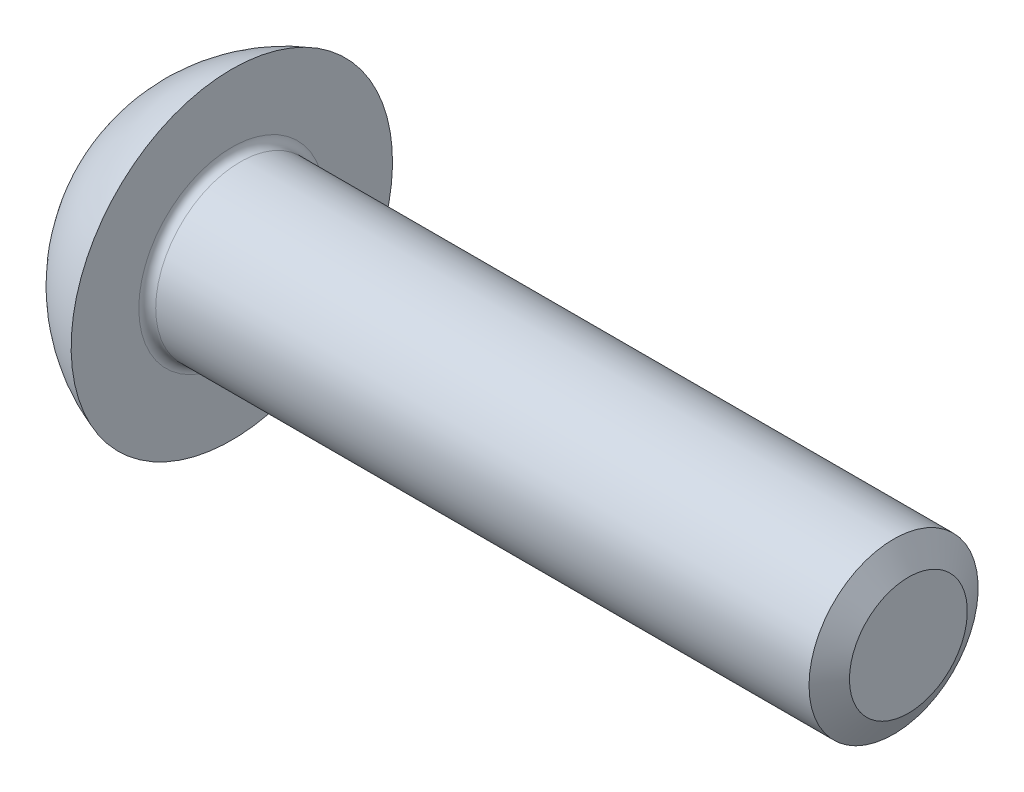
ISO-10303-21;
HEADER;
FILE_DESCRIPTION(('STEP AP214'),'2;1');
FILE_NAME('part.step','',(''),(''),'','','');
FILE_SCHEMA(('AUTOMOTIVE_DESIGN { 1 0 10303 214 1 1 1 1 }'));
ENDSEC;
DATA;
#1=APPLICATION_CONTEXT('core data for automotive mechanical design processes');
#2=APPLICATION_PROTOCOL_DEFINITION('international standard','automotive_design',2000,#1);
#3=PRODUCT_CONTEXT('',#1,'mechanical');
#4=PRODUCT('Part','Part','',(#3));
#5=PRODUCT_RELATED_PRODUCT_CATEGORY('part','',(#4));
#6=PRODUCT_DEFINITION_FORMATION('','',#4);
#7=PRODUCT_DEFINITION_CONTEXT('part definition',#1,'design');
#8=PRODUCT_DEFINITION('design','',#6,#7);
#9=PRODUCT_DEFINITION_SHAPE('','',#8);
#10=(LENGTH_UNIT() NAMED_UNIT(*) SI_UNIT(.MILLI.,.METRE.));
#11=(NAMED_UNIT(*) PLANE_ANGLE_UNIT() SI_UNIT($,.RADIAN.));
#12=(NAMED_UNIT(*) SI_UNIT($,.STERADIAN.) SOLID_ANGLE_UNIT());
#13=UNCERTAINTY_MEASURE_WITH_UNIT(LENGTH_MEASURE(1.E-05),#10,'distance_accuracy_value','');
#14=(GEOMETRIC_REPRESENTATION_CONTEXT(3) GLOBAL_UNCERTAINTY_ASSIGNED_CONTEXT((#13)) GLOBAL_UNIT_ASSIGNED_CONTEXT((#10,
#11,#12)) REPRESENTATION_CONTEXT('',''));
#15=CARTESIAN_POINT('',(0.,0.,0.));
#16=DIRECTION('',(0.,0.,1.));
#17=DIRECTION('',(1.,0.,0.));
#18=AXIS2_PLACEMENT_3D('',#15,#16,#17);
#19=CARTESIAN_POINT('',(-18.2,0.,0.));
#20=DIRECTION('',(-1.,0.,0.));
#21=DIRECTION('',(0.,0.,1.));
#22=AXIS2_PLACEMENT_3D('',#19,#20,#21);
#23=CYLINDRICAL_SURFACE('',#22,2.);
#24=CARTESIAN_POINT('',(-15.8,0.,0.));
#25=DIRECTION('',(-1.,0.,0.));
#26=DIRECTION('',(0.,0.,1.));
#27=AXIS2_PLACEMENT_3D('',#24,#25,#26);
#28=CIRCLE('',#27,2.);
#29=CARTESIAN_POINT('',(-15.8,0.,2.));
#30=VERTEX_POINT('',#29);
#31=EDGE_CURVE('E264',#30,#30,#28,.T.);
#32=ORIENTED_EDGE('',*,*,#31,.F.);
#33=EDGE_LOOP('',(#32));
#34=FACE_BOUND('',#33,.T.);
#35=CARTESIAN_POINT('',(-0.35,0.,0.));
#36=DIRECTION('',(-1.,0.,0.));
#37=DIRECTION('',(0.,0.,1.));
#38=AXIS2_PLACEMENT_3D('',#35,#36,#37);
#39=CIRCLE('',#38,2.);
#40=CARTESIAN_POINT('',(-0.35,0.,2.));
#41=VERTEX_POINT('',#40);
#42=EDGE_CURVE('E448',#41,#41,#39,.T.);
#43=ORIENTED_EDGE('',*,*,#42,.T.);
#44=EDGE_LOOP('',(#43));
#45=FACE_BOUND('',#44,.T.);
#46=ADVANCED_FACE('F42',(#34,#45),#23,.T.);
#47=CARTESIAN_POINT('',(-18.2,0.,0.));
#48=DIRECTION('',(1.,0.,0.));
#49=DIRECTION('',(0.,0.,-1.));
#50=AXIS2_PLACEMENT_3D('',#47,#48,#49);
#51=PLANE('',#50);
#52=CARTESIAN_POINT('',(-18.2,0.,0.));
#53=DIRECTION('',(-1.,0.,0.));
#54=DIRECTION('',(0.,0.,1.));
#55=AXIS2_PLACEMENT_3D('',#52,#53,#54);
#56=CIRCLE('',#55,2.);
#57=CARTESIAN_POINT('',(-18.2,2.,0.));
#58=VERTEX_POINT('',#57);
#59=EDGE_CURVE('E256',#58,#58,#56,.T.);
#60=ORIENTED_EDGE('',*,*,#59,.T.);
#61=EDGE_LOOP('',(#60));
#62=FACE_BOUND('',#61,.T.);
#63=CARTESIAN_POINT('',(-18.2,0.,0.));
#64=DIRECTION('',(1.,0.,0.));
#65=DIRECTION('',(0.,0.,-1.));
#66=AXIS2_PLACEMENT_3D('',#63,#64,#65);
#67=CIRCLE('',#66,1.44337567297406);
#68=CARTESIAN_POINT('',(-18.2,-0.721687836487032,-1.25));
#69=VERTEX_POINT('',#68);
#70=CARTESIAN_POINT('',(-18.2,-1.44337567297406,0.));
#71=VERTEX_POINT('',#70);
#72=EDGE_CURVE('E11',#69,#71,#67,.F.);
#73=ORIENTED_EDGE('',*,*,#72,.F.);
#74=CARTESIAN_POINT('',(-18.2,0.721687836487032,-1.25));
#75=VERTEX_POINT('',#74);
#76=EDGE_CURVE('E46',#75,#69,#67,.F.);
#77=ORIENTED_EDGE('',*,*,#76,.F.);
#78=CARTESIAN_POINT('',(-18.2,1.44337567297406,0.));
#79=VERTEX_POINT('',#78);
#80=EDGE_CURVE('E115',#79,#75,#67,.F.);
#81=ORIENTED_EDGE('',*,*,#80,.F.);
#82=CARTESIAN_POINT('',(-18.2,0.721687836487032,1.25));
#83=VERTEX_POINT('',#82);
#84=EDGE_CURVE('E329',#83,#79,#67,.F.);
#85=ORIENTED_EDGE('',*,*,#84,.F.);
#86=CARTESIAN_POINT('',(-18.2,-0.72168783648703,1.25));
#87=VERTEX_POINT('',#86);
#88=EDGE_CURVE('E51',#87,#83,#67,.F.);
#89=ORIENTED_EDGE('',*,*,#88,.F.);
#90=CARTESIAN_POINT('',(-18.2,0.,0.));
#91=DIRECTION('',(-1.,0.,0.));
#92=DIRECTION('',(0.,-1.,0.));
#93=AXIS2_PLACEMENT_3D('',#90,#91,#92);
#94=CIRCLE('',#93,1.44337567297406);
#95=EDGE_CURVE('E118',#71,#87,#94,.T.);
#96=ORIENTED_EDGE('',*,*,#95,.F.);
#97=EDGE_LOOP('',(#73,#77,#81,#85,#89,#96));
#98=FACE_BOUND('',#97,.T.);
#99=ADVANCED_FACE('F44',(#62,#98),#51,.F.);
#100=CARTESIAN_POINT('',(-14.7272727272727,0.,0.));
#101=DIRECTION('',(-1.,0.,0.));
#102=DIRECTION('',(0.,1.,0.));
#103=AXIS2_PLACEMENT_3D('',#100,#101,#102);
#104=SPHERICAL_SURFACE('',#103,4.00747235932374);
#105=CARTESIAN_POINT('',(-16.,0.,0.));
#106=DIRECTION('',(-1.,0.,0.));
#107=DIRECTION('',(0.,0.,1.));
#108=AXIS2_PLACEMENT_3D('',#105,#106,#107);
#109=CIRCLE('',#108,3.8);
#110=CARTESIAN_POINT('',(-16.,3.8,0.));
#111=VERTEX_POINT('',#110);
#112=EDGE_CURVE('E259',#111,#111,#109,.T.);
#113=CARTESIAN_POINT('',(-18.2,2.,0.));
#114=CARTESIAN_POINT('',(-18.1848940441993,2.02622955900731,0.));
#115=CARTESIAN_POINT('',(-18.1694908144314,2.05228791024858,0.));
#116=CARTESIAN_POINT('',(-18.1380979525594,2.10404896261472,0.));
#117=CARTESIAN_POINT('',(-18.1221083204554,2.12975166373959,0.));
#118=CARTESIAN_POINT('',(-18.0895507995097,2.18078818128854,0.));
#119=CARTESIAN_POINT('',(-18.072982910668,2.20612199771263,0.));
#120=CARTESIAN_POINT('',(-18.0392773993975,2.25640774959029,0.));
#121=CARTESIAN_POINT('',(-18.0221397769687,2.28135968504387,0.));
#122=CARTESIAN_POINT('',(-17.9873035925655,2.33086886166224,0.));
#123=CARTESIAN_POINT('',(-17.9696050305911,2.35542610282703,0.));
#124=CARTESIAN_POINT('',(-17.9336560549214,2.40413328370188,0.));
#125=CARTESIAN_POINT('',(-17.9154056412261,2.42828322341194,0.));
#126=CARTESIAN_POINT('',(-17.8783623317131,2.47616340238235,0.));
#127=CARTESIAN_POINT('',(-17.8595694358953,2.49989364164271,0.));
#128=CARTESIAN_POINT('',(-17.8214508106667,2.54692223644896,0.));
#129=CARTESIAN_POINT('',(-17.8021250812559,2.57022059199485,0.));
#130=CARTESIAN_POINT('',(-17.7629507108208,2.61637345777279,0.));
#131=CARTESIAN_POINT('',(-17.7431020697966,2.63922796800484,0.));
#132=CARTESIAN_POINT('',(-17.7028920666117,2.684481409448,0.));
#133=CARTESIAN_POINT('',(-17.682530704451,2.70688034065911,0.));
#134=CARTESIAN_POINT('',(-17.6413057126977,2.75121112424682,0.));
#135=CARTESIAN_POINT('',(-17.6204420831052,2.77314297662341,0.));
#136=CARTESIAN_POINT('',(-17.5782232680636,2.81652834253228,0.));
#137=CARTESIAN_POINT('',(-17.5568680826145,2.83798185606455,0.));
#138=CARTESIAN_POINT('',(-17.5136771198039,2.88039952985806,0.));
#139=CARTESIAN_POINT('',(-17.4918413424423,2.90136369011931,0.));
#140=CARTESIAN_POINT('',(-17.447700406491,2.94279189418254,0.));
#141=CARTESIAN_POINT('',(-17.4253952479013,2.96325593798452,0.));
#142=CARTESIAN_POINT('',(-17.3803270011625,3.00367340270524,0.));
#143=CARTESIAN_POINT('',(-17.3575639130134,3.02362682362399,0.));
#144=CARTESIAN_POINT('',(-17.3115914939299,3.06301279831263,0.));
#145=CARTESIAN_POINT('',(-17.2883821629955,3.08244535208254,0.));
#146=CARTESIAN_POINT('',(-17.2415291742204,3.12077961562579,0.));
#147=CARTESIAN_POINT('',(-17.2178855163797,3.13968132539914,0.));
#148=CARTESIAN_POINT('',(-17.1701760126585,3.17694419664163,0.));
#149=CARTESIAN_POINT('',(-17.1461101667779,3.19530535811077,0.));
#150=CARTESIAN_POINT('',(-17.0975686425984,3.23147770595957,0.));
#151=CARTESIAN_POINT('',(-17.0730929642995,3.24928889233922,0.));
#152=CARTESIAN_POINT('',(-17.0237443413165,3.28435214558591,0.));
#153=CARTESIAN_POINT('',(-16.9988713966324,3.30160421245294,0.));
#154=CARTESIAN_POINT('',(-16.9487410108723,3.3355403693082,0.));
#155=CARTESIAN_POINT('',(-16.9234835697963,3.35222445929642,0.));
#156=CARTESIAN_POINT('',(-16.8725971586496,3.38501609663248,0.));
#157=CARTESIAN_POINT('',(-16.846968188579,3.40112364398032,0.));
#158=CARTESIAN_POINT('',(-16.7953518775865,3.43275392627554,0.));
#159=CARTESIAN_POINT('',(-16.7693645366645,3.44827666122294,0.));
#160=CARTESIAN_POINT('',(-16.7170448261044,3.47872934920754,0.));
#161=CARTESIAN_POINT('',(-16.6907124564662,3.49365930224475,0.));
#162=CARTESIAN_POINT('',(-16.6377162077463,3.52291876123,0.));
#163=CARTESIAN_POINT('',(-16.6110523286645,3.53724826717803,0.));
#164=CARTESIAN_POINT('',(-16.5574067505418,3.56529947511373,0.));
#165=CARTESIAN_POINT('',(-16.5304250515009,3.57902117710138,0.));
#166=CARTESIAN_POINT('',(-16.4761576860719,3.60584973217452,0.));
#167=CARTESIAN_POINT('',(-16.4488720196837,3.61895658526,0.));
#168=CARTESIAN_POINT('',(-16.3940107283966,3.6445487137135,0.));
#169=CARTESIAN_POINT('',(-16.3664351034975,3.65703398908152,0.));
#170=CARTESIAN_POINT('',(-16.3110080522769,3.6813765507008,0.));
#171=CARTESIAN_POINT('',(-16.2831566259553,3.69323383695206,0.));
#172=CARTESIAN_POINT('',(-16.2271922728732,3.71631433772655,0.));
#173=CARTESIAN_POINT('',(-16.1990793461126,3.72753755224977,0.));
#174=CARTESIAN_POINT('',(-16.1426064188229,3.74934412871163,0.));
#175=CARTESIAN_POINT('',(-16.1142464182937,3.75992749065027,0.));
#176=CARTESIAN_POINT('',(-16.0572939289701,3.78044899835327,0.));
#177=CARTESIAN_POINT('',(-16.0287014401756,3.79038714411763,0.));
#178=CARTESIAN_POINT('',(-16.,3.8,0.));
#179=B_SPLINE_CURVE_WITH_KNOTS('',3,(#113,#114,#115,#116,#117,#118,#119,#120,#121,#122,#123,
#124,#125,#126,#127,#128,#129,#130,#131,#132,#133,#134,#135,#136,#137,#138,#139,#140,#141,#142,
#143,#144,#145,#146,#147,#148,#149,#150,#151,#152,#153,#154,#155,#156,#157,#158,#159,#160,#161,
#162,#163,#164,#165,#166,#167,#168,#169,#170,#171,#172,#173,#174,#175,#176,#177,#178),
.UNSPECIFIED.,.F.,.F.,(4,2,2,2,2,2,2,2,2,2,2,2,2,2,2,2,2,2,2,2,2,2,2,2,2,2,2,2,2,2,2,2,4),(0.,
0.0908034330338798,0.181606866067758,0.272410299101637,0.363213732135517,0.454017165169398,
0.544820598203277,0.635624031237155,0.726427464271035,0.817230897304915,0.908034330338794,
0.998837763372674,1.08964119640655,1.18044462944043,1.27124806247431,1.36205149550819,
1.45285492854207,1.54365836157595,1.63446179460983,1.72526522764371,1.81606866067759,
1.90687209371147,1.99767552674535,2.08847895977922,2.17928239281311,2.27008582584699,
2.36088925888086,2.45169269191474,2.54249612494862,2.6332995579825,2.72410299101638,
2.81490642405026,2.90570985708414),.UNSPECIFIED.);
#180=EDGE_CURVE('BSEAM244',#58,#111,#179,.T.);
#181=ORIENTED_EDGE('',*,*,#59,.F.);
#182=ORIENTED_EDGE('',*,*,#112,.T.);
#183=ORIENTED_EDGE('',*,*,#180,.T.);
#184=ORIENTED_EDGE('',*,*,#180,.F.);
#185=EDGE_LOOP('',(#181,#183,#182,#184));
#186=FACE_BOUND('',#185,.T.);
#187=ADVANCED_FACE('F244',(#186),#104,.T.);
#188=CARTESIAN_POINT('',(-16.,2.2,0.));
#189=DIRECTION('',(-1.,0.,0.));
#190=DIRECTION('',(0.,0.,1.));
#191=AXIS2_PLACEMENT_3D('',#188,#189,#190);
#192=PLANE('',#191);
#193=ORIENTED_EDGE('',*,*,#112,.F.);
#194=EDGE_LOOP('',(#193));
#195=FACE_BOUND('',#194,.T.);
#196=CARTESIAN_POINT('',(-16.,0.,0.));
#197=DIRECTION('',(-1.,0.,0.));
#198=DIRECTION('',(0.,0.,1.));
#199=AXIS2_PLACEMENT_3D('',#196,#197,#198);
#200=CIRCLE('',#199,2.2);
#201=CARTESIAN_POINT('',(-16.,0.,2.2));
#202=VERTEX_POINT('',#201);
#203=EDGE_CURVE('E260',#202,#202,#200,.T.);
#204=ORIENTED_EDGE('',*,*,#203,.T.);
#205=EDGE_LOOP('',(#204));
#206=FACE_BOUND('',#205,.T.);
#207=ADVANCED_FACE('F241',(#195,#206),#192,.F.);
#208=CARTESIAN_POINT('',(-15.8,0.,0.));
#209=DIRECTION('',(-1.,0.,0.));
#210=DIRECTION('',(0.,0.,1.));
#211=AXIS2_PLACEMENT_3D('',#208,#209,#210);
#212=TOROIDAL_SURFACE('',#211,2.2,0.200000000000001);
#213=ORIENTED_EDGE('',*,*,#203,.F.);
#214=EDGE_LOOP('',(#213));
#215=FACE_BOUND('',#214,.T.);
#216=ORIENTED_EDGE('',*,*,#31,.T.);
#217=EDGE_LOOP('',(#216));
#218=FACE_BOUND('',#217,.T.);
#219=ADVANCED_FACE('F238',(#215,#218),#212,.F.);
#220=CARTESIAN_POINT('',(-17.83,0.,0.));
#221=DIRECTION('',(-1.,0.,0.));
#222=DIRECTION('',(0.,-1.,0.));
#223=AXIS2_PLACEMENT_3D('',#220,#221,#222);
#224=CONICAL_SURFACE('',#223,0.,1.31985626102756);
#225=CARTESIAN_POINT('',(-18.4099346759325,-1.88564456107599,-1.25));
#226=CARTESIAN_POINT('',(-18.3978717207476,-1.82917708741649,-1.25));
#227=CARTESIAN_POINT('',(-18.3859628503841,-1.7726766725723,-1.25));
#228=CARTESIAN_POINT('',(-18.3625309817374,-1.65959353753871,-1.25));
#229=CARTESIAN_POINT('',(-18.3510079994509,-1.60301081403846,-1.25));
#230=CARTESIAN_POINT('',(-18.3171150455956,-1.43301680255399,-1.25));
#231=CARTESIAN_POINT('',(-18.2954436732229,-1.31946408423816,-1.25));
#232=CARTESIAN_POINT('',(-18.2550957638519,-1.09274070822473,-1.25));
#233=CARTESIAN_POINT('',(-18.2363969731626,-0.979574090908787,-1.25));
#234=CARTESIAN_POINT('',(-18.2032623365578,-0.752620098767595,-1.25));
#235=CARTESIAN_POINT('',(-18.188825705465,-0.638832842215424,-1.25));
#236=CARTESIAN_POINT('',(-18.1660896767959,-0.409425109570646,-1.25));
#237=CARTESIAN_POINT('',(-18.1578544497063,-0.293797778292056,-1.25));
#238=CARTESIAN_POINT('',(-18.1515679025376,-0.120164512871692,-1.25));
#239=CARTESIAN_POINT('',(-18.150483164521,-0.0622627928697113,-1.25));
#240=CARTESIAN_POINT('',(-18.1503795328621,0.053542564363427,-1.25));
#241=CARTESIAN_POINT('',(-18.1513606413601,0.111446201596509,-1.25));
#242=CARTESIAN_POINT('',(-18.1573598650309,0.285474295611225,-1.25));
#243=CARTESIAN_POINT('',(-18.1654487463646,0.401498867331893,-1.25));
#244=CARTESIAN_POINT('',(-18.1881044285101,0.632939913567418,-1.25));
#245=CARTESIAN_POINT('',(-18.2026754362751,0.74835594383121,-1.25));
#246=CARTESIAN_POINT('',(-18.2365518645336,0.98087854833956,-1.25));
#247=CARTESIAN_POINT('',(-18.2559479393881,1.09797147869704,-1.25));
#248=CARTESIAN_POINT('',(-18.297694705209,1.33163516353435,-1.25));
#249=CARTESIAN_POINT('',(-18.3200458280349,1.44820583911091,-1.25));
#250=CARTESIAN_POINT('',(-18.3666691464558,1.68099121637415,-1.25));
#251=CARTESIAN_POINT('',(-18.3909418646374,1.7972058122361,-1.25));
#252=CARTESIAN_POINT('',(-18.4407644332086,2.02936144854685,-1.25));
#253=CARTESIAN_POINT('',(-18.4663143094331,2.14530248341221,-1.25));
#254=CARTESIAN_POINT('',(-18.518006571917,2.37571314631908,-1.25));
#255=CARTESIAN_POINT('',(-18.5441393559518,2.49018493743662,-1.25));
#256=CARTESIAN_POINT('',(-18.5970181249123,2.71898894131965,-1.25));
#257=CARTESIAN_POINT('',(-18.6237641225282,2.83332115114488,-1.25));
#258=CARTESIAN_POINT('',(-18.6776683130688,3.0617318786478,-1.25));
#259=CARTESIAN_POINT('',(-18.7048259274931,3.17581053313172,-1.25));
#260=CARTESIAN_POINT('',(-18.7594820608418,3.40388218743045,-1.25));
#261=CARTESIAN_POINT('',(-18.7869805683896,3.51787518996982,-1.25));
#262=CARTESIAN_POINT('',(-18.8145979060137,3.63183906574752,-1.25));
#263=B_SPLINE_CURVE_WITH_KNOTS('',3,(#225,#226,#227,#228,#229,#230,#231,#232,#233,#234,#235,
#236,#237,#238,#239,#240,#241,#242,#243,#244,#245,#246,#247,#248,#249,#250,#251,#252,#253,#254,
#255,#256,#257,#258,#259,#260,#261,#262),.UNSPECIFIED.,.F.,.F.,(4,2,2,2,2,2,2,2,2,2,2,2,2,2,2,2,
2,2,4),(0.,0.173224298995284,0.34645577001972,0.693239171189208,1.03728991141695,
1.38127723083866,1.72877689604066,1.90247833739643,2.07617995870962,2.42483219738435,
2.77371104508348,3.12971850144864,3.48577804345033,3.84193475233926,4.19809866864176,
4.55034691705481,4.90260246171336,5.25440194240086,5.60618971383705),.UNSPECIFIED.);
#264=EDGE_CURVE('E106',#69,#75,#263,.T.);
#265=ORIENTED_EDGE('',*,*,#264,.T.);
#266=ORIENTED_EDGE('',*,*,#76,.T.);
#267=EDGE_LOOP('',(#265,#266));
#268=FACE_BOUND('',#267,.T.);
#269=ADVANCED_FACE('F110',(#268),#224,.F.);
#270=CARTESIAN_POINT('',(-18.2000296035517,0.721572366433194,-1.2502));
#271=CARTESIAN_POINT('',(-18.1923376245114,0.751560236122211,-1.19825948608787));
#272=CARTESIAN_POINT('',(-18.1853558988612,0.781597955311093,-1.14623263030924));
#273=CARTESIAN_POINT('',(-18.1730912390252,0.841770545746215,-1.04201064645257));
#274=CARTESIAN_POINT('',(-18.1678089341386,0.871905448817341,-0.98981546325222));
#275=CARTESIAN_POINT('',(-18.1592477971586,0.932104975245319,-0.885546824887377));
#276=CARTESIAN_POINT('',(-18.1559596086559,0.962169257021959,-0.833473961357169));
#277=CARTESIAN_POINT('',(-18.1515506008694,1.0223329488635,-0.729267390316704));
#278=CARTESIAN_POINT('',(-18.1504293994002,1.05243235179702,-0.677133695158352));
#279=CARTESIAN_POINT('',(-18.1504293994002,1.11263115766407,-0.572866304841648));
#280=CARTESIAN_POINT('',(-18.1515506008694,1.1427305605976,-0.520732609683297));
#281=CARTESIAN_POINT('',(-18.1559596086559,1.20289425243914,-0.416526038642832));
#282=CARTESIAN_POINT('',(-18.1592477971586,1.23295853421578,-0.364453175112624));
#283=CARTESIAN_POINT('',(-18.1678089341386,1.29315806064375,-0.260184536747781));
#284=CARTESIAN_POINT('',(-18.1730912390252,1.32329296371488,-0.207989353547428));
#285=CARTESIAN_POINT('',(-18.1853558988612,1.38346555415,-0.103767369690763));
#286=CARTESIAN_POINT('',(-18.1923376245114,1.41350327333889,-0.0517405139121319));
#287=CARTESIAN_POINT('',(-18.2000296035517,1.4434911430279,0.000199999999999577));
#288=B_SPLINE_CURVE_WITH_KNOTS('',3,(#270,#271,#272,#273,#274,#275,#276,#277,#278,#279,#280,
#281,#282,#283,#284,#285,#286,#287),.UNSPECIFIED.,.F.,.F.,(4,2,2,2,2,2,2,2,4),(0.,
0.181409592460797,0.362886284169926,0.543504761741732,0.724091381228727,0.904678000715721,
1.08529647828753,1.26677316999665,1.44818276245745),.UNSPECIFIED.);
#289=EDGE_CURVE('E134',#75,#79,#288,.T.);
#290=ORIENTED_EDGE('',*,*,#289,.T.);
#291=ORIENTED_EDGE('',*,*,#80,.T.);
#292=EDGE_LOOP('',(#290,#291));
#293=FACE_BOUND('',#292,.T.);
#294=ADVANCED_FACE('F162',(#293),#224,.F.);
#295=CARTESIAN_POINT('',(-18.2000296035517,1.4434911430279,-0.000200000000000031));
#296=CARTESIAN_POINT('',(-18.1923376245114,1.41350327333889,0.0517405139121311));
#297=CARTESIAN_POINT('',(-18.1853558988612,1.38346555415,0.103767369690762));
#298=CARTESIAN_POINT('',(-18.1730912390252,1.32329296371488,0.207989353547427));
#299=CARTESIAN_POINT('',(-18.1678089341386,1.29315806064376,0.260184536747781));
#300=CARTESIAN_POINT('',(-18.1592477971586,1.23295853421578,0.364453175112623));
#301=CARTESIAN_POINT('',(-18.1559596086559,1.20289425243914,0.416526038642831));
#302=CARTESIAN_POINT('',(-18.1515506008694,1.1427305605976,0.520732609683296));
#303=CARTESIAN_POINT('',(-18.1504293994002,1.11263115766407,0.572866304841648));
#304=CARTESIAN_POINT('',(-18.1504293994002,1.05243235179702,0.677133695158351));
#305=CARTESIAN_POINT('',(-18.1515506008694,1.0223329488635,0.729267390316703));
#306=CARTESIAN_POINT('',(-18.1559596086559,0.96216925702196,0.833473961357168));
#307=CARTESIAN_POINT('',(-18.1592477971586,0.932104975245319,0.885546824887376));
#308=CARTESIAN_POINT('',(-18.1678089341386,0.871905448817342,0.989815463252219));
#309=CARTESIAN_POINT('',(-18.1730912390252,0.841770545746215,1.04201064645257));
#310=CARTESIAN_POINT('',(-18.1853558988612,0.781597955311093,1.14623263030924));
#311=CARTESIAN_POINT('',(-18.1923376245114,0.751560236122211,1.19825948608787));
#312=CARTESIAN_POINT('',(-18.2000296035517,0.721572366433195,1.2502));
#313=B_SPLINE_CURVE_WITH_KNOTS('',3,(#295,#296,#297,#298,#299,#300,#301,#302,#303,#304,#305,
#306,#307,#308,#309,#310,#311,#312),.UNSPECIFIED.,.F.,.F.,(4,2,2,2,2,2,2,2,4),(0.,
0.181409592460797,0.362886284169926,0.543504761741732,0.724091381228726,0.904678000715721,
1.08529647828753,1.26677316999666,1.44818276245745),.UNSPECIFIED.);
#314=EDGE_CURVE('E184',#79,#83,#313,.T.);
#315=ORIENTED_EDGE('',*,*,#314,.T.);
#316=ORIENTED_EDGE('',*,*,#84,.T.);
#317=EDGE_LOOP('',(#315,#316));
#318=FACE_BOUND('',#317,.T.);
#319=ADVANCED_FACE('F156',(#318),#224,.F.);
#320=CARTESIAN_POINT('',(-18.4099346759325,-1.88564456107599,1.25));
#321=CARTESIAN_POINT('',(-18.3978717207476,-1.82917708741649,1.25));
#322=CARTESIAN_POINT('',(-18.3859628503841,-1.7726766725723,1.25));
#323=CARTESIAN_POINT('',(-18.3625309817374,-1.65959353753871,1.25));
#324=CARTESIAN_POINT('',(-18.3510079994509,-1.60301081403846,1.25));
#325=CARTESIAN_POINT('',(-18.3171150455956,-1.43301680255399,1.25));
#326=CARTESIAN_POINT('',(-18.2954436732229,-1.31946408423816,1.25));
#327=CARTESIAN_POINT('',(-18.2550957638519,-1.09274070822473,1.25));
#328=CARTESIAN_POINT('',(-18.2363969731626,-0.979574090908788,1.25));
#329=CARTESIAN_POINT('',(-18.2032623365578,-0.752620098767595,1.25));
#330=CARTESIAN_POINT('',(-18.188825705465,-0.638832842215425,1.25));
#331=CARTESIAN_POINT('',(-18.1660896767959,-0.409425109570646,1.25));
#332=CARTESIAN_POINT('',(-18.1578544497063,-0.293797778292056,1.25));
#333=CARTESIAN_POINT('',(-18.1515679025376,-0.120164512871692,1.25));
#334=CARTESIAN_POINT('',(-18.150483164521,-0.0622627928697117,1.25));
#335=CARTESIAN_POINT('',(-18.1503795328621,0.0535425643634265,1.25));
#336=CARTESIAN_POINT('',(-18.1513606413601,0.111446201596508,1.25));
#337=CARTESIAN_POINT('',(-18.1573598650309,0.285474295611225,1.25));
#338=CARTESIAN_POINT('',(-18.1654487463646,0.401498867331893,1.25));
#339=CARTESIAN_POINT('',(-18.1881044285101,0.632939913567418,1.25));
#340=CARTESIAN_POINT('',(-18.2026754362751,0.74835594383121,1.25));
#341=CARTESIAN_POINT('',(-18.2365518645336,0.980878548339559,1.25));
#342=CARTESIAN_POINT('',(-18.2559479393881,1.09797147869704,1.25));
#343=CARTESIAN_POINT('',(-18.297694705209,1.33163516353435,1.25));
#344=CARTESIAN_POINT('',(-18.3200458280349,1.44820583911091,1.25));
#345=CARTESIAN_POINT('',(-18.3666691464558,1.68099121637415,1.25));
#346=CARTESIAN_POINT('',(-18.3909418646374,1.7972058122361,1.25));
#347=CARTESIAN_POINT('',(-18.4407644332086,2.02936144854685,1.25));
#348=CARTESIAN_POINT('',(-18.4663143094331,2.14530248341221,1.25));
#349=CARTESIAN_POINT('',(-18.518006571917,2.37571314631908,1.25));
#350=CARTESIAN_POINT('',(-18.5441393559518,2.49018493743662,1.25));
#351=CARTESIAN_POINT('',(-18.5970181249123,2.71898894131965,1.25));
#352=CARTESIAN_POINT('',(-18.6237641225282,2.83332115114489,1.25));
#353=CARTESIAN_POINT('',(-18.6776683130688,3.06173187864781,1.25));
#354=CARTESIAN_POINT('',(-18.7048259274931,3.17581053313172,1.25));
#355=CARTESIAN_POINT('',(-18.7594820608418,3.40388218743045,1.25));
#356=CARTESIAN_POINT('',(-18.7869805683896,3.51787518996982,1.25));
#357=CARTESIAN_POINT('',(-18.8145979060137,3.63183906574752,1.25));
#358=B_SPLINE_CURVE_WITH_KNOTS('',3,(#320,#321,#322,#323,#324,#325,#326,#327,#328,#329,#330,
#331,#332,#333,#334,#335,#336,#337,#338,#339,#340,#341,#342,#343,#344,#345,#346,#347,#348,#349,
#350,#351,#352,#353,#354,#355,#356,#357),.UNSPECIFIED.,.F.,.F.,(4,2,2,2,2,2,2,2,2,2,2,2,2,2,2,2,
2,2,4),(0.,0.173224298995284,0.346455770019719,0.693239171189208,1.03728991141695,
1.38127723083866,1.72877689604066,1.90247833739643,2.07617995870962,2.42483219738435,
2.77371104508348,3.12971850144864,3.48577804345033,3.84193475233926,4.19809866864176,
4.55034691705481,4.90260246171336,5.25440194240086,5.60618971383705),.UNSPECIFIED.);
#359=EDGE_CURVE('E63',#83,#87,#358,.F.);
#360=ORIENTED_EDGE('',*,*,#359,.T.);
#361=ORIENTED_EDGE('',*,*,#88,.T.);
#362=EDGE_LOOP('',(#360,#361));
#363=FACE_BOUND('',#362,.T.);
#364=ADVANCED_FACE('F161',(#363),#224,.F.);
#365=CARTESIAN_POINT('',(-18.2000296035517,-0.721572366433195,1.2502));
#366=CARTESIAN_POINT('',(-18.1923376245114,-0.751560236122212,1.19825948608787));
#367=CARTESIAN_POINT('',(-18.1853558988612,-0.781597955311094,1.14623263030924));
#368=CARTESIAN_POINT('',(-18.1730912390252,-0.841770545746216,1.04201064645257));
#369=CARTESIAN_POINT('',(-18.1678089341386,-0.871905448817342,0.989815463252219));
#370=CARTESIAN_POINT('',(-18.1592477971586,-0.93210497524532,0.885546824887376));
#371=CARTESIAN_POINT('',(-18.1559596086559,-0.96216925702196,0.833473961357168));
#372=CARTESIAN_POINT('',(-18.1515506008694,-1.0223329488635,0.729267390316703));
#373=CARTESIAN_POINT('',(-18.1504293994002,-1.05243235179702,0.677133695158351));
#374=CARTESIAN_POINT('',(-18.1504293994002,-1.11263115766407,0.572866304841648));
#375=CARTESIAN_POINT('',(-18.1515506008694,-1.1427305605976,0.520732609683296));
#376=CARTESIAN_POINT('',(-18.1559596086559,-1.20289425243914,0.416526038642831));
#377=CARTESIAN_POINT('',(-18.1592477971586,-1.23295853421578,0.364453175112623));
#378=CARTESIAN_POINT('',(-18.1678089341386,-1.29315806064376,0.260184536747781));
#379=CARTESIAN_POINT('',(-18.1730912390252,-1.32329296371488,0.207989353547427));
#380=CARTESIAN_POINT('',(-18.1853558988612,-1.38346555415,0.103767369690762));
#381=CARTESIAN_POINT('',(-18.1923376245114,-1.41350327333889,0.0517405139121311));
#382=CARTESIAN_POINT('',(-18.2000296035517,-1.4434911430279,-0.000200000000000362));
#383=B_SPLINE_CURVE_WITH_KNOTS('',3,(#365,#366,#367,#368,#369,#370,#371,#372,#373,#374,#375,
#376,#377,#378,#379,#380,#381,#382),.UNSPECIFIED.,.F.,.F.,(4,2,2,2,2,2,2,2,4),(0.,
0.181409592460798,0.362886284169927,0.543504761741732,0.724091381228727,0.904678000715722,
1.08529647828753,1.26677316999666,1.44818276245745),.UNSPECIFIED.);
#384=EDGE_CURVE('E57',#87,#71,#383,.T.);
#385=ORIENTED_EDGE('',*,*,#384,.T.);
#386=ORIENTED_EDGE('',*,*,#95,.T.);
#387=EDGE_LOOP('',(#385,#386));
#388=FACE_BOUND('',#387,.T.);
#389=ADVANCED_FACE('F316',(#388),#224,.F.);
#390=CARTESIAN_POINT('',(-18.2000296035517,-1.4434911430279,0.000199999999999629));
#391=CARTESIAN_POINT('',(-18.1923376245114,-1.41350327333889,-0.0517405139121314));
#392=CARTESIAN_POINT('',(-18.1853558988612,-1.38346555415,-0.103767369690762));
#393=CARTESIAN_POINT('',(-18.1730912390252,-1.32329296371488,-0.207989353547427));
#394=CARTESIAN_POINT('',(-18.1678089341386,-1.29315806064376,-0.260184536747781));
#395=CARTESIAN_POINT('',(-18.1592477971586,-1.23295853421578,-0.364453175112624));
#396=CARTESIAN_POINT('',(-18.1559596086559,-1.20289425243914,-0.416526038642832));
#397=CARTESIAN_POINT('',(-18.1515506008694,-1.1427305605976,-0.520732609683297));
#398=CARTESIAN_POINT('',(-18.1504293994002,-1.11263115766407,-0.572866304841648));
#399=CARTESIAN_POINT('',(-18.1504293994002,-1.05243235179702,-0.677133695158352));
#400=CARTESIAN_POINT('',(-18.1515506008694,-1.0223329488635,-0.729267390316704));
#401=CARTESIAN_POINT('',(-18.1559596086559,-0.96216925702196,-0.833473961357169));
#402=CARTESIAN_POINT('',(-18.1592477971586,-0.93210497524532,-0.885546824887377));
#403=CARTESIAN_POINT('',(-18.1678089341386,-0.871905448817342,-0.98981546325222));
#404=CARTESIAN_POINT('',(-18.1730912390252,-0.841770545746216,-1.04201064645257));
#405=CARTESIAN_POINT('',(-18.1853558988612,-0.781597955311094,-1.14623263030924));
#406=CARTESIAN_POINT('',(-18.1923376245114,-0.751560236122211,-1.19825948608787));
#407=CARTESIAN_POINT('',(-18.2000296035517,-0.721572366433195,-1.2502));
#408=B_SPLINE_CURVE_WITH_KNOTS('',3,(#390,#391,#392,#393,#394,#395,#396,#397,#398,#399,#400,
#401,#402,#403,#404,#405,#406,#407),.UNSPECIFIED.,.F.,.F.,(4,2,2,2,2,2,2,2,4),(0.,
0.181409592460797,0.362886284169926,0.543504761741732,0.724091381228727,0.904678000715722,
1.08529647828753,1.26677316999666,1.44818276245745),.UNSPECIFIED.);
#409=EDGE_CURVE('E98',#71,#69,#408,.T.);
#410=ORIENTED_EDGE('',*,*,#409,.T.);
#411=ORIENTED_EDGE('',*,*,#72,.T.);
#412=EDGE_LOOP('',(#410,#411));
#413=FACE_BOUND('',#412,.T.);
#414=ADVANCED_FACE('F100',(#413),#224,.F.);
#415=CARTESIAN_POINT('',(-16.9,0.,0.));
#416=DIRECTION('',(-1.,0.,0.));
#417=DIRECTION('',(0.,0.,1.));
#418=AXIS2_PLACEMENT_3D('',#415,#416,#417);
#419=CONICAL_SURFACE('',#418,1.44337567297406,1.01324881882863);
#420=CARTESIAN_POINT('',(-16.,0.,0.));
#421=VERTEX_POINT('',#420);
#422=VERTEX_LOOP('',#421);
#423=FACE_BOUND('',#422,.T.);
#424=CARTESIAN_POINT('',(-17.3527945795421,-1.77325319370587,1.25));
#425=CARTESIAN_POINT('',(-17.3272313608337,-1.72308054748254,1.25));
#426=CARTESIAN_POINT('',(-17.3019425610441,-1.67276579739611,1.25));
#427=CARTESIAN_POINT('',(-17.2520602884769,-1.57178113050656,1.25));
#428=CARTESIAN_POINT('',(-17.2274669508561,-1.52111114702254,1.25));
#429=CARTESIAN_POINT('',(-17.1789832389279,-1.41905106562435,1.25));
#430=CARTESIAN_POINT('',(-17.1550981267071,-1.36765845463947,1.25));
#431=CARTESIAN_POINT('',(-17.1084115654387,-1.26438731533743,1.25));
#432=CARTESIAN_POINT('',(-17.0856100580289,-1.21250881337054,1.25));
#433=CARTESIAN_POINT('',(-17.0180066296141,-1.05318865262781,1.25));
#434=CARTESIAN_POINT('',(-16.975348048821,-0.944818595736525,1.25));
#435=CARTESIAN_POINT('',(-16.899249765014,-0.725021793662279,1.25));
#436=CARTESIAN_POINT('',(-16.8657864364544,-0.613603706258271,1.25));
#437=CARTESIAN_POINT('',(-16.8255224000706,-0.439829475428558,1.25));
#438=CARTESIAN_POINT('',(-16.8135539759356,-0.378686784718629,1.25));
#439=CARTESIAN_POINT('',(-16.7946834115852,-0.255611326700578,1.25));
#440=CARTESIAN_POINT('',(-16.7877804723348,-0.19367868556883,1.25));
#441=CARTESIAN_POINT('',(-16.7797277447971,-0.0702459018996858,1.25));
#442=CARTESIAN_POINT('',(-16.7785036595021,-0.00875074655362734,1.25));
#443=CARTESIAN_POINT('',(-16.7817252928589,0.114091468273714,1.25));
#444=CARTESIAN_POINT('',(-16.7861717520863,0.175438507362529,1.25));
#445=CARTESIAN_POINT('',(-16.802790821166,0.318793774562431,1.25));
#446=CARTESIAN_POINT('',(-16.8171162097553,0.400550507800212,1.25));
#447=CARTESIAN_POINT('',(-16.8533604743273,0.56235775953531,1.25));
#448=CARTESIAN_POINT('',(-16.8752859853004,0.642406722094854,1.25));
#449=CARTESIAN_POINT('',(-16.9252263796582,0.802612605575798,1.25));
#450=CARTESIAN_POINT('',(-16.9533725953862,0.882727610112281,1.25));
#451=CARTESIAN_POINT('',(-17.0137044102596,1.04136692759758,1.25));
#452=CARTESIAN_POINT('',(-17.0458888175979,1.11989170196819,1.25));
#453=CARTESIAN_POINT('',(-17.1085113010088,1.26504456834479,1.25));
#454=CARTESIAN_POINT('',(-17.1385863298607,1.33183108575291,1.25));
#455=CARTESIAN_POINT('',(-17.2003370421044,1.46466259424516,1.25));
#456=CARTESIAN_POINT('',(-17.2320128472902,1.53070752843774,1.25));
#457=CARTESIAN_POINT('',(-17.3288612944515,1.72800114412657,1.25));
#458=CARTESIAN_POINT('',(-17.3958346146514,1.85836304165699,1.25));
#459=CARTESIAN_POINT('',(-17.5327729293065,2.11775589592147,1.25));
#460=CARTESIAN_POINT('',(-17.6027425964556,2.24678435317969,1.25));
#461=CARTESIAN_POINT('',(-17.7445495255551,2.50377456749809,1.25));
#462=CARTESIAN_POINT('',(-17.8163864088467,2.63173653399053,1.25));
#463=CARTESIAN_POINT('',(-17.9535702802704,2.87326192040095,1.25));
#464=CARTESIAN_POINT('',(-18.0187879458602,2.98689907544955,1.25));
#465=CARTESIAN_POINT('',(-18.1499753350724,3.21374706697092,1.25));
#466=CARTESIAN_POINT('',(-18.2159451030052,3.32695787779728,1.25));
#467=CARTESIAN_POINT('',(-18.3482234067217,3.55267191020502,1.25));
#468=CARTESIAN_POINT('',(-18.4145300682268,3.66517623176316,1.25));
#469=CARTESIAN_POINT('',(-18.5475751113016,3.8899176768681,1.25));
#470=CARTESIAN_POINT('',(-18.6143134591135,4.00215482039119,1.25));
#471=CARTESIAN_POINT('',(-18.6812102093033,4.11429687203232,1.25));
#472=B_SPLINE_CURVE_WITH_KNOTS('',3,(#424,#425,#426,#427,#428,#429,#430,#431,#432,#433,#434,
#435,#436,#437,#438,#439,#440,#441,#442,#443,#444,#445,#446,#447,#448,#449,#450,#451,#452,#453,
#454,#455,#456,#457,#458,#459,#460,#461,#462,#463,#464,#465,#466,#467,#468,#469,#470,#471),
.UNSPECIFIED.,.F.,.F.,(4,2,2,2,2,2,2,2,2,2,2,2,2,2,2,2,2,2,2,2,2,2,2,4),(0.,0.168930888086683,
0.337894383813143,0.50789846348262,0.67789337646512,1.0270708628597,1.3753426286684,
1.56207832532889,1.74878455976038,1.93304107769939,2.11732166208064,2.36583389677495,
2.61456363408265,2.86915526427585,3.12367193182966,3.34338375168395,3.56311231342189,
4.00271912781841,4.44303841363043,4.88326909182566,5.27633168545271,5.66941755741553,
6.06118706475327,6.45292629749501),.UNSPECIFIED.);
#473=CARTESIAN_POINT('',(-16.9,-0.721687836487033,1.25));
#474=VERTEX_POINT('',#473);
#475=CARTESIAN_POINT('',(-16.9,0.721687836487032,1.25));
#476=VERTEX_POINT('',#475);
#477=EDGE_CURVE('E200',#474,#476,#472,.T.);
#478=ORIENTED_EDGE('',*,*,#477,.T.);
#479=CARTESIAN_POINT('',(-16.9000720086393,0.721572366433195,1.2502));
#480=CARTESIAN_POINT('',(-16.8801448426332,0.753515397677925,1.19487304693637));
#481=CARTESIAN_POINT('',(-16.8620045541367,0.785780040598703,1.13898904610951));
#482=CARTESIAN_POINT('',(-16.8303569142874,0.850965440737864,1.02608462115678));
#483=CARTESIAN_POINT('',(-16.8168631745157,0.883887831667606,0.969061367359819));
#484=CARTESIAN_POINT('',(-16.7960025510557,0.949256047226193,0.855840296812232));
#485=CARTESIAN_POINT('',(-16.7884697729694,0.981688121259105,0.799666296792393));
#486=CARTESIAN_POINT('',(-16.7796634350083,1.04672261963105,0.687023241367426));
#487=CARTESIAN_POINT('',(-16.7783805168214,1.07932471605452,0.630554753928727));
#488=CARTESIAN_POINT('',(-16.7819049641253,1.13967644186336,0.526022498503348));
#489=CARTESIAN_POINT('',(-16.7858507725259,1.167439811789,0.477934931202806));
#490=CARTESIAN_POINT('',(-16.7980757188124,1.22275387862577,0.382128157068257));
#491=CARTESIAN_POINT('',(-16.8063595984707,1.25030430927563,0.334409411412305));
#492=CARTESIAN_POINT('',(-16.826962668364,1.30574431848064,0.23838449869714));
#493=CARTESIAN_POINT('',(-16.8393795573722,1.333624575995,0.190094476154151));
#494=CARTESIAN_POINT('',(-16.8674628627124,1.38890731580299,0.0943419620251049));
#495=CARTESIAN_POINT('',(-16.8831216709794,1.41631075671776,0.0468778100585218));
#496=CARTESIAN_POINT('',(-16.9000720086393,1.4434911430279,-0.000200000000000017));
#497=B_SPLINE_CURVE_WITH_KNOTS('',3,(#479,#480,#481,#482,#483,#484,#485,#486,#487,#488,#489,
#490,#491,#492,#493,#494,#495,#496),.UNSPECIFIED.,.F.,.F.,(4,2,2,2,2,2,2,2,4),(0.,
0.200864252203224,0.402312007110811,0.597934215834184,0.793263416779519,0.960084042532226,
1.12708739503102,1.29835788316976,1.46923090317111),.UNSPECIFIED.);
#498=CARTESIAN_POINT('',(-16.9,1.44337567297406,0.));
#499=VERTEX_POINT('',#498);
#500=EDGE_CURVE('E208',#476,#499,#497,.T.);
#501=ORIENTED_EDGE('',*,*,#500,.T.);
#502=CARTESIAN_POINT('',(-16.9000720086393,1.4434911430279,0.000199999999999767));
#503=CARTESIAN_POINT('',(-16.8801448426332,1.41154811178317,-0.055126953063633));
#504=CARTESIAN_POINT('',(-16.8620045541367,1.37928346886239,-0.111010953890489));
#505=CARTESIAN_POINT('',(-16.8303569142874,1.31409806872323,-0.223915378843222));
#506=CARTESIAN_POINT('',(-16.8168631745157,1.28117567779349,-0.280938632640181));
#507=CARTESIAN_POINT('',(-16.7960025510557,1.2158074622349,-0.394159703187767));
#508=CARTESIAN_POINT('',(-16.7884697729694,1.18337538820199,-0.450333703207607));
#509=CARTESIAN_POINT('',(-16.7796634350083,1.11834088983005,-0.562976758632573));
#510=CARTESIAN_POINT('',(-16.7783805168214,1.08573879340658,-0.619445246071272));
#511=CARTESIAN_POINT('',(-16.7819049641253,1.02538706759774,-0.723977501496652));
#512=CARTESIAN_POINT('',(-16.7858507725259,0.997623697672097,-0.772065068797194));
#513=CARTESIAN_POINT('',(-16.7980757188124,0.942309630835326,-0.867871842931743));
#514=CARTESIAN_POINT('',(-16.8063595984707,0.914759200185471,-0.915590588587695));
#515=CARTESIAN_POINT('',(-16.826962668364,0.85931919098046,-1.01161550130286));
#516=CARTESIAN_POINT('',(-16.8393795573722,0.831438933466092,-1.05990552384585));
#517=CARTESIAN_POINT('',(-16.8674628627124,0.776156193658104,-1.1556580379749));
#518=CARTESIAN_POINT('',(-16.8831216709794,0.74875275274334,-1.20312218994148));
#519=CARTESIAN_POINT('',(-16.9000720086393,0.721572366433194,-1.2502));
#520=B_SPLINE_CURVE_WITH_KNOTS('',3,(#502,#503,#504,#505,#506,#507,#508,#509,#510,#511,#512,
#513,#514,#515,#516,#517,#518,#519),.UNSPECIFIED.,.F.,.F.,(4,2,2,2,2,2,2,2,4),(0.,
0.200864252203224,0.402312007110811,0.597934215834184,0.793263416779519,0.960084042532226,
1.12708739503102,1.29835788316976,1.46923090317111),.UNSPECIFIED.);
#521=CARTESIAN_POINT('',(-16.9,0.721687836487033,-1.25));
#522=VERTEX_POINT('',#521);
#523=EDGE_CURVE('E116',#499,#522,#520,.T.);
#524=ORIENTED_EDGE('',*,*,#523,.T.);
#525=CARTESIAN_POINT('',(-17.3527945795421,-1.77325319370587,-1.25));
#526=CARTESIAN_POINT('',(-17.3272313608337,-1.72308054748254,-1.25));
#527=CARTESIAN_POINT('',(-17.3019425610441,-1.67276579739611,-1.25));
#528=CARTESIAN_POINT('',(-17.2520602884769,-1.57178113050656,-1.25));
#529=CARTESIAN_POINT('',(-17.2274669508561,-1.52111114702254,-1.25));
#530=CARTESIAN_POINT('',(-17.1789832389279,-1.41905106562435,-1.25));
#531=CARTESIAN_POINT('',(-17.1550981267071,-1.36765845463947,-1.25));
#532=CARTESIAN_POINT('',(-17.1084115654387,-1.26438731533743,-1.25));
#533=CARTESIAN_POINT('',(-17.0856100580289,-1.21250881337054,-1.25));
#534=CARTESIAN_POINT('',(-17.0180066296141,-1.05318865262781,-1.25));
#535=CARTESIAN_POINT('',(-16.975348048821,-0.944818595736525,-1.25));
#536=CARTESIAN_POINT('',(-16.899249765014,-0.725021793662279,-1.25));
#537=CARTESIAN_POINT('',(-16.8657864364544,-0.613603706258271,-1.25));
#538=CARTESIAN_POINT('',(-16.8255224000706,-0.439829475428558,-1.25));
#539=CARTESIAN_POINT('',(-16.8135539759356,-0.378686784718629,-1.25));
#540=CARTESIAN_POINT('',(-16.7946834115852,-0.255611326700577,-1.25));
#541=CARTESIAN_POINT('',(-16.7877804723348,-0.19367868556883,-1.25));
#542=CARTESIAN_POINT('',(-16.7797277447971,-0.0702459018996855,-1.25));
#543=CARTESIAN_POINT('',(-16.7785036595021,-0.00875074655362698,-1.25));
#544=CARTESIAN_POINT('',(-16.7817252928589,0.114091468273714,-1.25));
#545=CARTESIAN_POINT('',(-16.7861717520863,0.17543850736253,-1.25));
#546=CARTESIAN_POINT('',(-16.802790821166,0.318793774562432,-1.25));
#547=CARTESIAN_POINT('',(-16.8171162097553,0.400550507800212,-1.25));
#548=CARTESIAN_POINT('',(-16.8533604743273,0.56235775953531,-1.25));
#549=CARTESIAN_POINT('',(-16.8752859853004,0.642406722094854,-1.25));
#550=CARTESIAN_POINT('',(-16.9252263796581,0.802612605575799,-1.25));
#551=CARTESIAN_POINT('',(-16.9533725953862,0.882727610112281,-1.25));
#552=CARTESIAN_POINT('',(-17.0137044102596,1.04136692759758,-1.25));
#553=CARTESIAN_POINT('',(-17.0458888175979,1.11989170196819,-1.25));
#554=CARTESIAN_POINT('',(-17.1085113010088,1.26504456834479,-1.25));
#555=CARTESIAN_POINT('',(-17.1385863298607,1.33183108575291,-1.25));
#556=CARTESIAN_POINT('',(-17.2003370421044,1.46466259424516,-1.25));
#557=CARTESIAN_POINT('',(-17.2320128472902,1.53070752843773,-1.25));
#558=CARTESIAN_POINT('',(-17.3288612944515,1.72800114412657,-1.25));
#559=CARTESIAN_POINT('',(-17.3958346146514,1.85836304165698,-1.25));
#560=CARTESIAN_POINT('',(-17.5327729293065,2.11775589592146,-1.25));
#561=CARTESIAN_POINT('',(-17.6027425964556,2.24678435317969,-1.25));
#562=CARTESIAN_POINT('',(-17.7445495255551,2.50377456749809,-1.25));
#563=CARTESIAN_POINT('',(-17.8163864088467,2.63173653399052,-1.25));
#564=CARTESIAN_POINT('',(-17.9535702802704,2.87326192040095,-1.25));
#565=CARTESIAN_POINT('',(-18.0187879458601,2.98689907544954,-1.25));
#566=CARTESIAN_POINT('',(-18.1499753350724,3.21374706697092,-1.25));
#567=CARTESIAN_POINT('',(-18.2159451030052,3.32695787779727,-1.25));
#568=CARTESIAN_POINT('',(-18.3482234067217,3.55267191020501,-1.25));
#569=CARTESIAN_POINT('',(-18.4145300682268,3.66517623176316,-1.25));
#570=CARTESIAN_POINT('',(-18.5475751113016,3.88991767686809,-1.25));
#571=CARTESIAN_POINT('',(-18.6143134591135,4.00215482039119,-1.25));
#572=CARTESIAN_POINT('',(-18.6812102093033,4.11429687203232,-1.25));
#573=B_SPLINE_CURVE_WITH_KNOTS('',3,(#525,#526,#527,#528,#529,#530,#531,#532,#533,#534,#535,
#536,#537,#538,#539,#540,#541,#542,#543,#544,#545,#546,#547,#548,#549,#550,#551,#552,#553,#554,
#555,#556,#557,#558,#559,#560,#561,#562,#563,#564,#565,#566,#567,#568,#569,#570,#571,#572),
.UNSPECIFIED.,.F.,.F.,(4,2,2,2,2,2,2,2,2,2,2,2,2,2,2,2,2,2,2,2,2,2,2,4),(0.,0.168930888086682,
0.337894383813142,0.507898463482618,0.677893376465118,1.0270708628597,1.37534262866839,
1.56207832532889,1.74878455976038,1.93304107769939,2.11732166208064,2.36583389677495,
2.61456363408265,2.86915526427585,3.12367193182965,3.34338375168395,3.56311231342189,
4.0027191278184,4.44303841363042,4.88326909182565,5.27633168545271,5.66941755741552,
6.06118706475326,6.45292629749501),.UNSPECIFIED.);
#574=CARTESIAN_POINT('',(-16.9,-0.721687836487033,-1.25));
#575=VERTEX_POINT('',#574);
#576=EDGE_CURVE('E273',#522,#575,#573,.F.);
#577=ORIENTED_EDGE('',*,*,#576,.T.);
#578=CARTESIAN_POINT('',(-16.9000720086393,-0.721572366433195,-1.2502));
#579=CARTESIAN_POINT('',(-16.8801448426332,-0.753515397677925,-1.19487304693637));
#580=CARTESIAN_POINT('',(-16.8620045541367,-0.785780040598704,-1.13898904610951));
#581=CARTESIAN_POINT('',(-16.8303569142874,-0.850965440737864,-1.02608462115678));
#582=CARTESIAN_POINT('',(-16.8168631745157,-0.883887831667607,-0.969061367359819));
#583=CARTESIAN_POINT('',(-16.7960025510557,-0.949256047226193,-0.855840296812233));
#584=CARTESIAN_POINT('',(-16.7884697729694,-0.981688121259106,-0.799666296792394));
#585=CARTESIAN_POINT('',(-16.7796634350083,-1.04672261963105,-0.687023241367427));
#586=CARTESIAN_POINT('',(-16.7783805168214,-1.07932471605452,-0.630554753928728));
#587=CARTESIAN_POINT('',(-16.7819049641253,-1.13967644186336,-0.526022498503349));
#588=CARTESIAN_POINT('',(-16.7858507725259,-1.167439811789,-0.477934931202807));
#589=CARTESIAN_POINT('',(-16.7980757188124,-1.22275387862577,-0.382128157068258));
#590=CARTESIAN_POINT('',(-16.8063595984707,-1.25030430927563,-0.334409411412306));
#591=CARTESIAN_POINT('',(-16.826962668364,-1.30574431848064,-0.238384498697141));
#592=CARTESIAN_POINT('',(-16.8393795573722,-1.333624575995,-0.190094476154152));
#593=CARTESIAN_POINT('',(-16.8674628627124,-1.38890731580299,-0.0943419620251063));
#594=CARTESIAN_POINT('',(-16.8831216709794,-1.41631075671776,-0.0468778100585234));
#595=CARTESIAN_POINT('',(-16.9000720086393,-1.4434911430279,0.000199999999998982));
#596=B_SPLINE_CURVE_WITH_KNOTS('',3,(#578,#579,#580,#581,#582,#583,#584,#585,#586,#587,#588,
#589,#590,#591,#592,#593,#594,#595),.UNSPECIFIED.,.F.,.F.,(4,2,2,2,2,2,2,2,4),(0.,
0.200864252203224,0.402312007110811,0.597934215834183,0.793263416779518,0.960084042532225,
1.12708739503102,1.29835788316976,1.46923090317111),.UNSPECIFIED.);
#597=CARTESIAN_POINT('',(-16.9,-1.44337567297407,0.));
#598=VERTEX_POINT('',#597);
#599=EDGE_CURVE('E124',#575,#598,#596,.T.);
#600=ORIENTED_EDGE('',*,*,#599,.T.);
#601=CARTESIAN_POINT('',(-16.9000720086393,-1.4434911430279,-0.000200000000000587));
#602=CARTESIAN_POINT('',(-16.8801448426332,-1.41154811178317,0.0551269530636323));
#603=CARTESIAN_POINT('',(-16.8620045541367,-1.37928346886239,0.111010953890488));
#604=CARTESIAN_POINT('',(-16.8303569142874,-1.31409806872323,0.223915378843221));
#605=CARTESIAN_POINT('',(-16.8168631745157,-1.28117567779349,0.28093863264018));
#606=CARTESIAN_POINT('',(-16.7960025510557,-1.21580746223491,0.394159703187766));
#607=CARTESIAN_POINT('',(-16.7884697729694,-1.18337538820199,0.450333703207606));
#608=CARTESIAN_POINT('',(-16.7796634350083,-1.11834088983005,0.562976758632572));
#609=CARTESIAN_POINT('',(-16.7783805168214,-1.08573879340658,0.619445246071271));
#610=CARTESIAN_POINT('',(-16.7819049641253,-1.02538706759774,0.72397750149665));
#611=CARTESIAN_POINT('',(-16.7858507725259,-0.997623697672099,0.772065068797193));
#612=CARTESIAN_POINT('',(-16.7980757188124,-0.942309630835327,0.867871842931742));
#613=CARTESIAN_POINT('',(-16.8063595984707,-0.914759200185472,0.915590588587694));
#614=CARTESIAN_POINT('',(-16.826962668364,-0.859319190980462,1.01161550130286));
#615=CARTESIAN_POINT('',(-16.8393795573722,-0.831438933466094,1.05990552384585));
#616=CARTESIAN_POINT('',(-16.8674628627124,-0.776156193658105,1.15565803797489));
#617=CARTESIAN_POINT('',(-16.8831216709794,-0.748752752743341,1.20312218994148));
#618=CARTESIAN_POINT('',(-16.9000720086393,-0.721572366433195,1.2502));
#619=B_SPLINE_CURVE_WITH_KNOTS('',3,(#601,#602,#603,#604,#605,#606,#607,#608,#609,#610,#611,
#612,#613,#614,#615,#616,#617,#618),.UNSPECIFIED.,.F.,.F.,(4,2,2,2,2,2,2,2,4),(0.,
0.200864252203224,0.402312007110811,0.597934215834183,0.793263416779518,0.960084042532226,
1.12708739503102,1.29835788316976,1.46923090317111),.UNSPECIFIED.);
#620=EDGE_CURVE('E209',#598,#474,#619,.T.);
#621=ORIENTED_EDGE('',*,*,#620,.T.);
#622=EDGE_LOOP('',(#478,#501,#524,#577,#600,#621));
#623=FACE_BOUND('',#622,.T.);
#624=ADVANCED_FACE('F165',(#423,#623),#419,.F.);
#625=CARTESIAN_POINT('',(-16.,1.44337567297406,0.));
#626=DIRECTION('',(0.,0.866025403784439,-0.5));
#627=DIRECTION('',(0.,0.5,0.866025403784439));
#628=AXIS2_PLACEMENT_3D('',#625,#626,#627);
#629=PLANE('',#628);
#630=ORIENTED_EDGE('',*,*,#289,.F.);
#631=DIRECTION('',(-1.,0.,0.));
#632=VECTOR('',#631,1.);
#633=CARTESIAN_POINT('',(-16.,0.721687836487032,-1.25));
#634=LINE('',#633,#632);
#635=EDGE_CURVE('E129',#522,#75,#634,.T.);
#636=ORIENTED_EDGE('',*,*,#635,.F.);
#637=ORIENTED_EDGE('',*,*,#523,.F.);
#638=DIRECTION('',(-1.,0.,0.));
#639=VECTOR('',#638,1.);
#640=CARTESIAN_POINT('',(-16.,1.44337567297406,0.));
#641=LINE('',#640,#639);
#642=EDGE_CURVE('E221',#499,#79,#641,.T.);
#643=ORIENTED_EDGE('',*,*,#642,.T.);
#644=EDGE_LOOP('',(#630,#636,#637,#643));
#645=FACE_BOUND('',#644,.T.);
#646=ADVANCED_FACE('F228',(#645),#629,.F.);
#647=CARTESIAN_POINT('',(-16.,0.721687836487032,-1.25));
#648=DIRECTION('',(0.,0.,-1.));
#649=DIRECTION('',(-1.,0.,0.));
#650=AXIS2_PLACEMENT_3D('',#647,#648,#649);
#651=PLANE('',#650);
#652=ORIENTED_EDGE('',*,*,#264,.F.);
#653=DIRECTION('',(-1.,0.,0.));
#654=VECTOR('',#653,1.);
#655=CARTESIAN_POINT('',(-16.,-0.721687836487033,-1.25));
#656=LINE('',#655,#654);
#657=EDGE_CURVE('E121',#575,#69,#656,.T.);
#658=ORIENTED_EDGE('',*,*,#657,.F.);
#659=ORIENTED_EDGE('',*,*,#576,.F.);
#660=ORIENTED_EDGE('',*,*,#635,.T.);
#661=EDGE_LOOP('',(#652,#658,#659,#660));
#662=FACE_BOUND('',#661,.T.);
#663=ADVANCED_FACE('F132',(#662),#651,.F.);
#664=CARTESIAN_POINT('',(-16.,-0.721687836487033,-1.25));
#665=DIRECTION('',(0.,-0.866025403784438,-0.5));
#666=DIRECTION('',(0.,0.5,-0.866025403784439));
#667=AXIS2_PLACEMENT_3D('',#664,#665,#666);
#668=PLANE('',#667);
#669=ORIENTED_EDGE('',*,*,#409,.F.);
#670=DIRECTION('',(-1.,0.,0.));
#671=VECTOR('',#670,1.);
#672=CARTESIAN_POINT('',(-16.,-1.44337567297407,0.));
#673=LINE('',#672,#671);
#674=EDGE_CURVE('E128',#598,#71,#673,.T.);
#675=ORIENTED_EDGE('',*,*,#674,.F.);
#676=ORIENTED_EDGE('',*,*,#599,.F.);
#677=ORIENTED_EDGE('',*,*,#657,.T.);
#678=EDGE_LOOP('',(#669,#675,#676,#677));
#679=FACE_BOUND('',#678,.T.);
#680=ADVANCED_FACE('F122',(#679),#668,.F.);
#681=CARTESIAN_POINT('',(-16.,-1.44337567297407,0.));
#682=DIRECTION('',(0.,-0.866025403784439,0.5));
#683=DIRECTION('',(0.,-0.5,-0.866025403784439));
#684=AXIS2_PLACEMENT_3D('',#681,#682,#683);
#685=PLANE('',#684);
#686=ORIENTED_EDGE('',*,*,#384,.F.);
#687=DIRECTION('',(-1.,0.,0.));
#688=VECTOR('',#687,1.);
#689=CARTESIAN_POINT('',(-16.,-0.721687836487033,1.25));
#690=LINE('',#689,#688);
#691=EDGE_CURVE('E285',#474,#87,#690,.T.);
#692=ORIENTED_EDGE('',*,*,#691,.F.);
#693=ORIENTED_EDGE('',*,*,#620,.F.);
#694=ORIENTED_EDGE('',*,*,#674,.T.);
#695=EDGE_LOOP('',(#686,#692,#693,#694));
#696=FACE_BOUND('',#695,.T.);
#697=ADVANCED_FACE('F195',(#696),#685,.F.);
#698=CARTESIAN_POINT('',(-16.,-0.721687836487033,1.25));
#699=DIRECTION('',(0.,0.,1.));
#700=DIRECTION('',(1.,0.,0.));
#701=AXIS2_PLACEMENT_3D('',#698,#699,#700);
#702=PLANE('',#701);
#703=ORIENTED_EDGE('',*,*,#359,.F.);
#704=DIRECTION('',(-1.,0.,0.));
#705=VECTOR('',#704,1.);
#706=CARTESIAN_POINT('',(-16.,0.721687836487032,1.25));
#707=LINE('',#706,#705);
#708=EDGE_CURVE('E222',#476,#83,#707,.T.);
#709=ORIENTED_EDGE('',*,*,#708,.F.);
#710=ORIENTED_EDGE('',*,*,#477,.F.);
#711=ORIENTED_EDGE('',*,*,#691,.T.);
#712=EDGE_LOOP('',(#703,#709,#710,#711));
#713=FACE_BOUND('',#712,.T.);
#714=ADVANCED_FACE('F191',(#713),#702,.F.);
#715=CARTESIAN_POINT('',(-16.,0.721687836487032,1.25));
#716=DIRECTION('',(0.,0.866025403784439,0.5));
#717=DIRECTION('',(0.,-0.5,0.866025403784439));
#718=AXIS2_PLACEMENT_3D('',#715,#716,#717);
#719=PLANE('',#718);
#720=ORIENTED_EDGE('',*,*,#314,.F.);
#721=ORIENTED_EDGE('',*,*,#642,.F.);
#722=ORIENTED_EDGE('',*,*,#500,.F.);
#723=ORIENTED_EDGE('',*,*,#708,.T.);
#724=EDGE_LOOP('',(#720,#721,#722,#723));
#725=FACE_BOUND('',#724,.T.);
#726=ADVANCED_FACE('F194',(#725),#719,.F.);
#727=CARTESIAN_POINT('',(-0.35,0.,0.));
#728=DIRECTION('',(-1.,0.,0.));
#729=DIRECTION('',(0.,0.,1.));
#730=AXIS2_PLACEMENT_3D('',#727,#728,#729);
#731=CONICAL_SURFACE('',#730,2.,1.0471975511966);
#732=CARTESIAN_POINT('',(0.,0.,0.));
#733=DIRECTION('',(-1.,0.,0.));
#734=DIRECTION('',(0.,0.,1.));
#735=AXIS2_PLACEMENT_3D('',#732,#733,#734);
#736=CIRCLE('',#735,1.39378221735089);
#737=CARTESIAN_POINT('',(0.,0.,1.39378221735089));
#738=VERTEX_POINT('',#737);
#739=EDGE_CURVE('E445',#738,#738,#736,.T.);
#740=ORIENTED_EDGE('',*,*,#739,.T.);
#741=EDGE_LOOP('',(#740));
#742=FACE_BOUND('',#741,.T.);
#743=ORIENTED_EDGE('',*,*,#42,.F.);
#744=EDGE_LOOP('',(#743));
#745=FACE_BOUND('',#744,.T.);
#746=ADVANCED_FACE('F164',(#742,#745),#731,.T.);
#747=CARTESIAN_POINT('',(0.,2.,0.));
#748=DIRECTION('',(-1.,0.,0.));
#749=DIRECTION('',(0.,0.,1.));
#750=AXIS2_PLACEMENT_3D('',#747,#748,#749);
#751=PLANE('',#750);
#752=ORIENTED_EDGE('',*,*,#739,.F.);
#753=EDGE_LOOP('',(#752));
#754=FACE_BOUND('',#753,.T.);
#755=ADVANCED_FACE('F230',(#754),#751,.F.);
#756=CLOSED_SHELL('',(#46,#99,#187,#207,#219,#269,#294,#319,#364,#389,#414,#624,#646,#663,#680,
#697,#714,#726,#746,#755));
#757=MANIFOLD_SOLID_BREP('B2',#756);
#758=ADVANCED_BREP_SHAPE_REPRESENTATION('',(#18,#757),#14);
#759=SHAPE_DEFINITION_REPRESENTATION(#9,#758);
ENDSEC;
END-ISO-10303-21;
